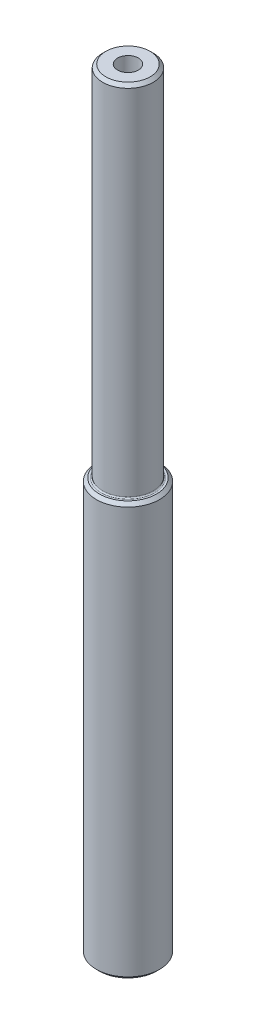
ISO-10303-21;
HEADER;
FILE_DESCRIPTION(('STEP AP214'),'2;1');
FILE_NAME('part.step','',(''),(''),'','','');
FILE_SCHEMA(('AUTOMOTIVE_DESIGN { 1 0 10303 214 1 1 1 1 }'));
ENDSEC;
DATA;
#1=APPLICATION_CONTEXT('core data for automotive mechanical design processes');
#2=APPLICATION_PROTOCOL_DEFINITION('international standard','automotive_design',2000,#1);
#3=PRODUCT_CONTEXT('',#1,'mechanical');
#4=PRODUCT('Part','Part','',(#3));
#5=PRODUCT_RELATED_PRODUCT_CATEGORY('part','',(#4));
#6=PRODUCT_DEFINITION_FORMATION('','',#4);
#7=PRODUCT_DEFINITION_CONTEXT('part definition',#1,'design');
#8=PRODUCT_DEFINITION('design','',#6,#7);
#9=PRODUCT_DEFINITION_SHAPE('','',#8);
#10=(LENGTH_UNIT() NAMED_UNIT(*) SI_UNIT(.MILLI.,.METRE.));
#11=(NAMED_UNIT(*) PLANE_ANGLE_UNIT() SI_UNIT($,.RADIAN.));
#12=(NAMED_UNIT(*) SI_UNIT($,.STERADIAN.) SOLID_ANGLE_UNIT());
#13=UNCERTAINTY_MEASURE_WITH_UNIT(LENGTH_MEASURE(1.E-05),#10,'distance_accuracy_value','');
#14=(GEOMETRIC_REPRESENTATION_CONTEXT(3) GLOBAL_UNCERTAINTY_ASSIGNED_CONTEXT((#13)) GLOBAL_UNIT_ASSIGNED_CONTEXT((#10,
#11,#12)) REPRESENTATION_CONTEXT('',''));
#15=CARTESIAN_POINT('',(0.,0.,0.));
#16=DIRECTION('',(0.,0.,1.));
#17=DIRECTION('',(1.,0.,0.));
#18=AXIS2_PLACEMENT_3D('',#15,#16,#17);
#19=CARTESIAN_POINT('',(0.,0.,0.));
#20=DIRECTION('',(0.,1.,0.));
#21=DIRECTION('',(0.,0.,1.));
#22=AXIS2_PLACEMENT_3D('',#19,#20,#21);
#23=PLANE('',#22);
#24=CARTESIAN_POINT('',(0.,0.,0.));
#25=DIRECTION('',(0.,1.,0.));
#26=DIRECTION('',(0.,0.,1.));
#27=AXIS2_PLACEMENT_3D('',#24,#25,#26);
#28=CIRCLE('',#27,4.49999999999998);
#29=CARTESIAN_POINT('',(0.,0.,4.49999999999998));
#30=VERTEX_POINT('',#29);
#31=EDGE_CURVE('E100',#30,#30,#28,.F.);
#32=ORIENTED_EDGE('',*,*,#31,.T.);
#33=EDGE_LOOP('',(#32));
#34=FACE_BOUND('',#33,.T.);
#35=CARTESIAN_POINT('',(0.,0.,0.));
#36=DIRECTION('',(0.,-1.,0.));
#37=DIRECTION('',(0.,0.,-1.));
#38=AXIS2_PLACEMENT_3D('',#35,#36,#37);
#39=CIRCLE('',#38,1.64999999999999);
#40=CARTESIAN_POINT('',(0.,0.,-1.64999999999999));
#41=VERTEX_POINT('',#40);
#42=EDGE_CURVE('E70',#41,#41,#39,.T.);
#43=ORIENTED_EDGE('',*,*,#42,.F.);
#44=EDGE_LOOP('',(#43));
#45=FACE_BOUND('',#44,.T.);
#46=ADVANCED_FACE('F44',(#34,#45),#23,.F.);
#47=CARTESIAN_POINT('',(0.,7.47619047619048,0.));
#48=DIRECTION('',(0.,1.,0.));
#49=DIRECTION('',(0.,0.,1.));
#50=AXIS2_PLACEMENT_3D('',#47,#48,#49);
#51=CYLINDRICAL_SURFACE('',#50,4.99999999999999);
#52=CARTESIAN_POINT('',(0.,0.500000000000001,0.));
#53=DIRECTION('',(0.,1.,0.));
#54=DIRECTION('',(0.,0.,1.));
#55=AXIS2_PLACEMENT_3D('',#52,#53,#54);
#56=CIRCLE('',#55,4.99999999999999);
#57=CARTESIAN_POINT('',(0.,0.500000000000001,4.99999999999999));
#58=VERTEX_POINT('',#57);
#59=EDGE_CURVE('E96',#58,#58,#56,.T.);
#60=ORIENTED_EDGE('',*,*,#59,.T.);
#61=EDGE_LOOP('',(#60));
#62=FACE_BOUND('',#61,.T.);
#63=CARTESIAN_POINT('',(0.,64.85,0.));
#64=DIRECTION('',(0.,-1.,0.));
#65=DIRECTION('',(0.,0.,-1.));
#66=AXIS2_PLACEMENT_3D('',#63,#64,#65);
#67=CIRCLE('',#66,4.99999999999999);
#68=CARTESIAN_POINT('',(0.,64.85,-4.99999999999999));
#69=VERTEX_POINT('',#68);
#70=EDGE_CURVE('E92',#69,#69,#67,.T.);
#71=ORIENTED_EDGE('',*,*,#70,.T.);
#72=EDGE_LOOP('',(#71));
#73=FACE_BOUND('',#72,.T.);
#74=ADVANCED_FACE('F124',(#62,#73),#51,.T.);
#75=CARTESIAN_POINT('',(4.99999999999999,65.35,0.));
#76=DIRECTION('',(0.,-1.,0.));
#77=DIRECTION('',(0.,0.,-1.));
#78=AXIS2_PLACEMENT_3D('',#75,#76,#77);
#79=PLANE('',#78);
#80=CARTESIAN_POINT('',(0.,65.35,0.));
#81=DIRECTION('',(0.,-1.,0.));
#82=DIRECTION('',(0.,0.,-1.));
#83=AXIS2_PLACEMENT_3D('',#80,#81,#82);
#84=CIRCLE('',#83,4.5);
#85=CARTESIAN_POINT('',(0.,65.35,-4.5));
#86=VERTEX_POINT('',#85);
#87=EDGE_CURVE('E104',#86,#86,#84,.F.);
#88=ORIENTED_EDGE('',*,*,#87,.T.);
#89=EDGE_LOOP('',(#88));
#90=FACE_BOUND('',#89,.T.);
#91=CARTESIAN_POINT('',(0.,65.35,0.));
#92=DIRECTION('',(0.,-1.,0.));
#93=DIRECTION('',(0.,0.,-1.));
#94=AXIS2_PLACEMENT_3D('',#91,#92,#93);
#95=CIRCLE('',#94,4.19999999999999);
#96=CARTESIAN_POINT('',(0.,65.35,-4.19999999999999));
#97=VERTEX_POINT('',#96);
#98=EDGE_CURVE('E88',#97,#97,#95,.T.);
#99=ORIENTED_EDGE('',*,*,#98,.T.);
#100=EDGE_LOOP('',(#99));
#101=FACE_BOUND('',#100,.T.);
#102=ADVANCED_FACE('F131',(#90,#101),#79,.F.);
#103=CARTESIAN_POINT('',(0.,7.47619047619048,0.));
#104=DIRECTION('',(0.,1.,0.));
#105=DIRECTION('',(0.,0.,1.));
#106=AXIS2_PLACEMENT_3D('',#103,#104,#105);
#107=CYLINDRICAL_SURFACE('',#106,3.99999999999999);
#108=CARTESIAN_POINT('',(0.,121.5,0.));
#109=DIRECTION('',(0.,-1.,0.));
#110=DIRECTION('',(0.,0.,-1.));
#111=AXIS2_PLACEMENT_3D('',#108,#109,#110);
#112=CIRCLE('',#111,3.99999999999999);
#113=CARTESIAN_POINT('',(0.,121.5,-3.99999999999999));
#114=VERTEX_POINT('',#113);
#115=EDGE_CURVE('E11',#114,#114,#112,.T.);
#116=ORIENTED_EDGE('',*,*,#115,.T.);
#117=EDGE_LOOP('',(#116));
#118=FACE_BOUND('',#117,.T.);
#119=CARTESIAN_POINT('',(0.,65.55,0.));
#120=DIRECTION('',(0.,-1.,0.));
#121=DIRECTION('',(0.,0.,-1.));
#122=AXIS2_PLACEMENT_3D('',#119,#120,#121);
#123=CIRCLE('',#122,3.99999999999999);
#124=CARTESIAN_POINT('',(0.,65.55,-3.99999999999999));
#125=VERTEX_POINT('',#124);
#126=EDGE_CURVE('E84',#125,#125,#123,.F.);
#127=ORIENTED_EDGE('',*,*,#126,.T.);
#128=EDGE_LOOP('',(#127));
#129=FACE_BOUND('',#128,.T.);
#130=ADVANCED_FACE('F155',(#118,#129),#107,.T.);
#131=CARTESIAN_POINT('',(3.99999999999999,122.,0.));
#132=DIRECTION('',(0.,-1.,0.));
#133=DIRECTION('',(0.,0.,-1.));
#134=AXIS2_PLACEMENT_3D('',#131,#132,#133);
#135=PLANE('',#134);
#136=CARTESIAN_POINT('',(0.,122.,0.));
#137=DIRECTION('',(0.,-1.,0.));
#138=DIRECTION('',(0.,0.,-1.));
#139=AXIS2_PLACEMENT_3D('',#136,#137,#138);
#140=CIRCLE('',#139,3.49999999999999);
#141=CARTESIAN_POINT('',(0.,122.,-3.49999999999999));
#142=VERTEX_POINT('',#141);
#143=EDGE_CURVE('E53',#142,#142,#140,.F.);
#144=ORIENTED_EDGE('',*,*,#143,.T.);
#145=EDGE_LOOP('',(#144));
#146=FACE_BOUND('',#145,.T.);
#147=CARTESIAN_POINT('',(0.,122.,0.));
#148=DIRECTION('',(0.,1.,0.));
#149=DIRECTION('',(0.,0.,1.));
#150=AXIS2_PLACEMENT_3D('',#147,#148,#149);
#151=CIRCLE('',#150,1.64999999999999);
#152=CARTESIAN_POINT('',(0.,122.,1.64999999999999));
#153=VERTEX_POINT('',#152);
#154=EDGE_CURVE('E71',#153,#153,#151,.T.);
#155=ORIENTED_EDGE('',*,*,#154,.F.);
#156=EDGE_LOOP('',(#155));
#157=FACE_BOUND('',#156,.T.);
#158=ADVANCED_FACE('F111',(#146,#157),#135,.F.);
#159=CARTESIAN_POINT('',(0.,12.,0.));
#160=DIRECTION('',(0.,-1.,0.));
#161=DIRECTION('',(0.,0.,-1.));
#162=AXIS2_PLACEMENT_3D('',#159,#160,#161);
#163=CONICAL_SURFACE('',#162,1.64999999999999,1.02974425867665);
#164=CARTESIAN_POINT('',(0.,12.9914200213955,0.));
#165=VERTEX_POINT('',#164);
#166=VERTEX_LOOP('',#165);
#167=FACE_BOUND('',#166,.T.);
#168=CARTESIAN_POINT('',(0.,12.,0.));
#169=DIRECTION('',(0.,-1.,0.));
#170=DIRECTION('',(0.,0.,-1.));
#171=AXIS2_PLACEMENT_3D('',#168,#169,#170);
#172=CIRCLE('',#171,1.64999999999999);
#173=CARTESIAN_POINT('',(0.,12.,-1.64999999999999));
#174=VERTEX_POINT('',#173);
#175=EDGE_CURVE('E76',#174,#174,#172,.T.);
#176=ORIENTED_EDGE('',*,*,#175,.T.);
#177=EDGE_LOOP('',(#176));
#178=FACE_BOUND('',#177,.T.);
#179=ADVANCED_FACE('F166',(#167,#178),#163,.F.);
#180=CARTESIAN_POINT('',(0.,0.,0.));
#181=DIRECTION('',(0.,-1.,0.));
#182=DIRECTION('',(0.,0.,-1.));
#183=AXIS2_PLACEMENT_3D('',#180,#181,#182);
#184=CYLINDRICAL_SURFACE('',#183,1.64999999999999);
#185=ORIENTED_EDGE('',*,*,#175,.F.);
#186=EDGE_LOOP('',(#185));
#187=FACE_BOUND('',#186,.T.);
#188=ORIENTED_EDGE('',*,*,#42,.T.);
#189=EDGE_LOOP('',(#188));
#190=FACE_BOUND('',#189,.T.);
#191=ADVANCED_FACE('F63',(#187,#190),#184,.F.);
#192=CARTESIAN_POINT('',(0.,110.,0.));
#193=DIRECTION('',(0.,1.,0.));
#194=DIRECTION('',(0.,0.,1.));
#195=AXIS2_PLACEMENT_3D('',#192,#193,#194);
#196=CONICAL_SURFACE('',#195,1.64999999999999,1.02974425867665);
#197=CARTESIAN_POINT('',(0.,109.008579978605,0.));
#198=VERTEX_POINT('',#197);
#199=VERTEX_LOOP('',#198);
#200=FACE_BOUND('',#199,.T.);
#201=CARTESIAN_POINT('',(0.,110.,0.));
#202=DIRECTION('',(0.,1.,0.));
#203=DIRECTION('',(0.,0.,1.));
#204=AXIS2_PLACEMENT_3D('',#201,#202,#203);
#205=CIRCLE('',#204,1.64999999999999);
#206=CARTESIAN_POINT('',(0.,110.,1.64999999999999));
#207=VERTEX_POINT('',#206);
#208=EDGE_CURVE('E67',#207,#207,#205,.T.);
#209=ORIENTED_EDGE('',*,*,#208,.T.);
#210=EDGE_LOOP('',(#209));
#211=FACE_BOUND('',#210,.T.);
#212=ADVANCED_FACE('F59',(#200,#211),#196,.F.);
#213=CARTESIAN_POINT('',(0.,122.,0.));
#214=DIRECTION('',(0.,1.,0.));
#215=DIRECTION('',(0.,0.,1.));
#216=AXIS2_PLACEMENT_3D('',#213,#214,#215);
#217=CYLINDRICAL_SURFACE('',#216,1.64999999999999);
#218=ORIENTED_EDGE('',*,*,#208,.F.);
#219=EDGE_LOOP('',(#218));
#220=FACE_BOUND('',#219,.T.);
#221=ORIENTED_EDGE('',*,*,#154,.T.);
#222=EDGE_LOOP('',(#221));
#223=FACE_BOUND('',#222,.T.);
#224=ADVANCED_FACE('F62',(#220,#223),#217,.F.);
#225=CARTESIAN_POINT('',(0.,65.55,0.));
#226=DIRECTION('',(0.,-1.,0.));
#227=DIRECTION('',(0.,0.,-1.));
#228=AXIS2_PLACEMENT_3D('',#225,#226,#227);
#229=TOROIDAL_SURFACE('',#228,4.19999999999999,0.2);
#230=ORIENTED_EDGE('',*,*,#98,.F.);
#231=EDGE_LOOP('',(#230));
#232=FACE_BOUND('',#231,.T.);
#233=ORIENTED_EDGE('',*,*,#126,.F.);
#234=EDGE_LOOP('',(#233));
#235=FACE_BOUND('',#234,.T.);
#236=ADVANCED_FACE('F137',(#232,#235),#229,.F.);
#237=CARTESIAN_POINT('',(0.,0.500000000000001,0.));
#238=DIRECTION('',(0.,1.,0.));
#239=DIRECTION('',(0.,0.,1.));
#240=AXIS2_PLACEMENT_3D('',#237,#238,#239);
#241=CONICAL_SURFACE('',#240,4.99999999999999,0.785398163397466);
#242=ORIENTED_EDGE('',*,*,#31,.F.);
#243=EDGE_LOOP('',(#242));
#244=FACE_BOUND('',#243,.T.);
#245=ORIENTED_EDGE('',*,*,#59,.F.);
#246=EDGE_LOOP('',(#245));
#247=FACE_BOUND('',#246,.T.);
#248=ADVANCED_FACE('F120',(#244,#247),#241,.T.);
#249=CARTESIAN_POINT('',(0.,65.35,0.));
#250=DIRECTION('',(0.,-1.,0.));
#251=DIRECTION('',(0.,0.,-1.));
#252=AXIS2_PLACEMENT_3D('',#249,#250,#251);
#253=CONICAL_SURFACE('',#252,4.5,0.785398163397453);
#254=ORIENTED_EDGE('',*,*,#70,.F.);
#255=EDGE_LOOP('',(#254));
#256=FACE_BOUND('',#255,.T.);
#257=ORIENTED_EDGE('',*,*,#87,.F.);
#258=EDGE_LOOP('',(#257));
#259=FACE_BOUND('',#258,.T.);
#260=ADVANCED_FACE('F115',(#256,#259),#253,.T.);
#261=CARTESIAN_POINT('',(0.,122.,0.));
#262=DIRECTION('',(0.,-1.,0.));
#263=DIRECTION('',(0.,0.,-1.));
#264=AXIS2_PLACEMENT_3D('',#261,#262,#263);
#265=CONICAL_SURFACE('',#264,3.49999999999999,0.785398163397451);
#266=ORIENTED_EDGE('',*,*,#115,.F.);
#267=EDGE_LOOP('',(#266));
#268=FACE_BOUND('',#267,.T.);
#269=ORIENTED_EDGE('',*,*,#143,.F.);
#270=EDGE_LOOP('',(#269));
#271=FACE_BOUND('',#270,.T.);
#272=ADVANCED_FACE('F46',(#268,#271),#265,.T.);
#273=CLOSED_SHELL('',(#46,#74,#102,#130,#158,#179,#191,#212,#224,#236,#248,#260,#272));
#274=MANIFOLD_SOLID_BREP('B2',#273);
#275=ADVANCED_BREP_SHAPE_REPRESENTATION('',(#18,#274),#14);
#276=SHAPE_DEFINITION_REPRESENTATION(#9,#275);
ENDSEC;
END-ISO-10303-21;
